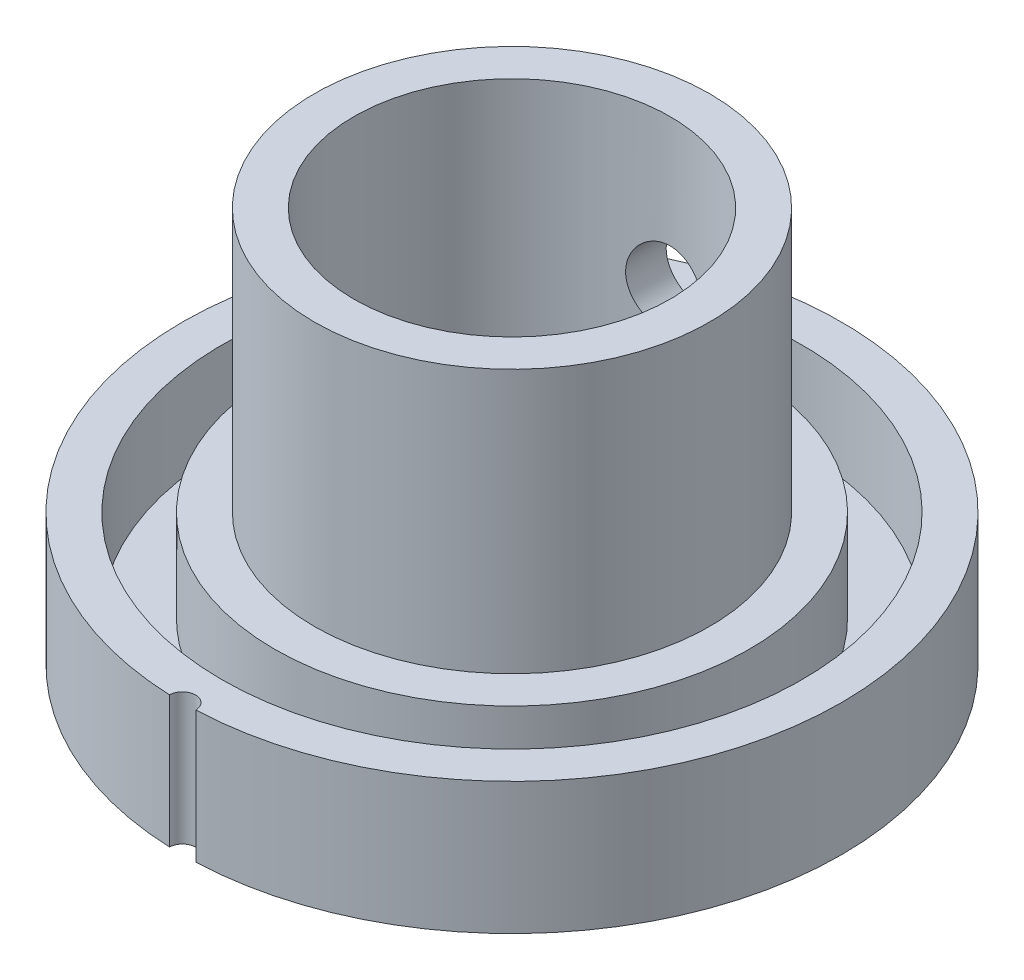
ISO-10303-21;
HEADER;
FILE_DESCRIPTION(('STEP AP214'),'2;1');
FILE_NAME('part.step','',(''),(''),'','','');
FILE_SCHEMA(('AUTOMOTIVE_DESIGN { 1 0 10303 214 1 1 1 1 }'));
ENDSEC;
DATA;
#1=APPLICATION_CONTEXT('core data for automotive mechanical design processes');
#2=APPLICATION_PROTOCOL_DEFINITION('international standard','automotive_design',2000,#1);
#3=PRODUCT_CONTEXT('',#1,'mechanical');
#4=PRODUCT('Part','Part','',(#3));
#5=PRODUCT_RELATED_PRODUCT_CATEGORY('part','',(#4));
#6=PRODUCT_DEFINITION_FORMATION('','',#4);
#7=PRODUCT_DEFINITION_CONTEXT('part definition',#1,'design');
#8=PRODUCT_DEFINITION('design','',#6,#7);
#9=PRODUCT_DEFINITION_SHAPE('','',#8);
#10=(LENGTH_UNIT() NAMED_UNIT(*) SI_UNIT(.MILLI.,.METRE.));
#11=(NAMED_UNIT(*) PLANE_ANGLE_UNIT() SI_UNIT($,.RADIAN.));
#12=(NAMED_UNIT(*) SI_UNIT($,.STERADIAN.) SOLID_ANGLE_UNIT());
#13=UNCERTAINTY_MEASURE_WITH_UNIT(LENGTH_MEASURE(1.E-05),#10,'distance_accuracy_value','');
#14=(GEOMETRIC_REPRESENTATION_CONTEXT(3) GLOBAL_UNCERTAINTY_ASSIGNED_CONTEXT((#13)) GLOBAL_UNIT_ASSIGNED_CONTEXT((#10,
#11,#12)) REPRESENTATION_CONTEXT('',''));
#15=CARTESIAN_POINT('',(0.,0.,0.));
#16=DIRECTION('',(0.,0.,1.));
#17=DIRECTION('',(1.,0.,0.));
#18=AXIS2_PLACEMENT_3D('',#15,#16,#17);
#19=CARTESIAN_POINT('',(0.,0.,0.));
#20=DIRECTION('',(0.,1.,0.));
#21=DIRECTION('',(0.,0.,1.));
#22=AXIS2_PLACEMENT_3D('',#19,#20,#21);
#23=PLANE('',#22);
#24=DIRECTION('',(-1.,0.,0.));
#25=VECTOR('',#24,1.);
#26=CARTESIAN_POINT('',(-7.,0.,-2.));
#27=LINE('',#26,#25);
#28=CARTESIAN_POINT('',(7.,0.,-2.));
#29=VERTEX_POINT('',#28);
#30=CARTESIAN_POINT('',(1.,0.,-2.));
#31=VERTEX_POINT('',#30);
#32=EDGE_CURVE('E164',#29,#31,#27,.T.);
#33=ORIENTED_EDGE('',*,*,#32,.T.);
#34=DIRECTION('',(0.,0.,1.));
#35=VECTOR('',#34,1.);
#36=CARTESIAN_POINT('',(1.,0.,2.));
#37=LINE('',#36,#35);
#38=CARTESIAN_POINT('',(1.,0.,2.));
#39=VERTEX_POINT('',#38);
#40=EDGE_CURVE('E146',#31,#39,#37,.T.);
#41=ORIENTED_EDGE('',*,*,#40,.T.);
#42=DIRECTION('',(1.,0.,0.));
#43=VECTOR('',#42,1.);
#44=CARTESIAN_POINT('',(-7.,0.,2.));
#45=LINE('',#44,#43);
#46=CARTESIAN_POINT('',(7.,0.,2.));
#47=VERTEX_POINT('',#46);
#48=EDGE_CURVE('E152',#39,#47,#45,.T.);
#49=ORIENTED_EDGE('',*,*,#48,.T.);
#50=DIRECTION('',(0.,0.,-1.));
#51=VECTOR('',#50,1.);
#52=CARTESIAN_POINT('',(7.,0.,2.));
#53=LINE('',#52,#51);
#54=EDGE_CURVE('E219',#47,#29,#53,.T.);
#55=ORIENTED_EDGE('',*,*,#54,.T.);
#56=EDGE_LOOP('',(#33,#41,#49,#55));
#57=FACE_BOUND('',#56,.T.);
#58=CARTESIAN_POINT('',(0.,0.,0.));
#59=DIRECTION('',(0.,1.,0.));
#60=DIRECTION('',(0.,0.,1.));
#61=AXIS2_PLACEMENT_3D('',#58,#59,#60);
#62=CIRCLE('',#61,12.5);
#63=CARTESIAN_POINT('',(0.499899989998,0.,12.49));
#64=VERTEX_POINT('',#63);
#65=CARTESIAN_POINT('',(-0.499899989998,0.,12.49));
#66=VERTEX_POINT('',#65);
#67=EDGE_CURVE('E124',#64,#66,#62,.T.);
#68=ORIENTED_EDGE('',*,*,#67,.F.);
#69=CARTESIAN_POINT('',(0.,0.,12.5));
#70=DIRECTION('',(0.,-1.,0.));
#71=DIRECTION('',(0.,0.,-1.));
#72=AXIS2_PLACEMENT_3D('',#69,#70,#71);
#73=CIRCLE('',#72,0.5);
#74=EDGE_CURVE('E113',#66,#64,#73,.T.);
#75=ORIENTED_EDGE('',*,*,#74,.F.);
#76=EDGE_LOOP('',(#68,#75));
#77=FACE_BOUND('',#76,.T.);
#78=DIRECTION('',(0.,0.,-1.));
#79=VECTOR('',#78,1.);
#80=CARTESIAN_POINT('',(-1.,0.,2.));
#81=LINE('',#80,#79);
#82=CARTESIAN_POINT('',(-1.,0.,2.));
#83=VERTEX_POINT('',#82);
#84=CARTESIAN_POINT('',(-1.,0.,-2.));
#85=VERTEX_POINT('',#84);
#86=EDGE_CURVE('E68',#83,#85,#81,.T.);
#87=ORIENTED_EDGE('',*,*,#86,.T.);
#88=CARTESIAN_POINT('',(-7.,0.,-2.));
#89=VERTEX_POINT('',#88);
#90=EDGE_CURVE('E220',#85,#89,#27,.T.);
#91=ORIENTED_EDGE('',*,*,#90,.T.);
#92=DIRECTION('',(0.,0.,1.));
#93=VECTOR('',#92,1.);
#94=CARTESIAN_POINT('',(-7.,0.,2.));
#95=LINE('',#94,#93);
#96=CARTESIAN_POINT('',(-7.,0.,2.));
#97=VERTEX_POINT('',#96);
#98=EDGE_CURVE('E161',#89,#97,#95,.T.);
#99=ORIENTED_EDGE('',*,*,#98,.T.);
#100=EDGE_CURVE('E160',#97,#83,#45,.T.);
#101=ORIENTED_EDGE('',*,*,#100,.T.);
#102=EDGE_LOOP('',(#87,#91,#99,#101));
#103=FACE_BOUND('',#102,.T.);
#104=ADVANCED_FACE('F39',(#57,#77,#103),#23,.F.);
#105=CARTESIAN_POINT('',(0.,5.,0.));
#106=DIRECTION('',(0.,-1.,0.));
#107=DIRECTION('',(0.,0.,-1.));
#108=AXIS2_PLACEMENT_3D('',#105,#106,#107);
#109=CYLINDRICAL_SURFACE('',#108,12.5);
#110=ORIENTED_EDGE('',*,*,#67,.T.);
#111=DIRECTION('',(0.,-1.,0.));
#112=VECTOR('',#111,1.);
#113=CARTESIAN_POINT('',(-0.499899989998,2.5,12.49));
#114=LINE('',#113,#112);
#115=CARTESIAN_POINT('',(-0.499899989997999,5.,12.49));
#116=VERTEX_POINT('',#115);
#117=EDGE_CURVE('E116',#116,#66,#114,.T.);
#118=ORIENTED_EDGE('',*,*,#117,.F.);
#119=CARTESIAN_POINT('',(0.,5.,0.));
#120=DIRECTION('',(0.,1.,0.));
#121=DIRECTION('',(0.,0.,1.));
#122=AXIS2_PLACEMENT_3D('',#119,#120,#121);
#123=CIRCLE('',#122,12.5);
#124=CARTESIAN_POINT('',(0.499899989997999,5.,12.49));
#125=VERTEX_POINT('',#124);
#126=EDGE_CURVE('E126',#125,#116,#123,.T.);
#127=ORIENTED_EDGE('',*,*,#126,.F.);
#128=DIRECTION('',(0.,-1.,0.));
#129=VECTOR('',#128,1.);
#130=CARTESIAN_POINT('',(0.499899989998,2.5,12.49));
#131=LINE('',#130,#129);
#132=EDGE_CURVE('E60',#64,#125,#131,.F.);
#133=ORIENTED_EDGE('',*,*,#132,.F.);
#134=EDGE_LOOP('',(#110,#118,#127,#133));
#135=FACE_BOUND('',#134,.T.);
#136=ADVANCED_FACE('F41',(#135),#109,.T.);
#137=CARTESIAN_POINT('',(0.,5.,0.));
#138=DIRECTION('',(0.,1.,0.));
#139=DIRECTION('',(0.,0.,1.));
#140=AXIS2_PLACEMENT_3D('',#137,#138,#139);
#141=PLANE('',#140);
#142=CARTESIAN_POINT('',(0.,5.,12.5));
#143=DIRECTION('',(0.,1.,0.));
#144=DIRECTION('',(0.,0.,1.));
#145=AXIS2_PLACEMENT_3D('',#142,#143,#144);
#146=CIRCLE('',#145,0.5);
#147=EDGE_CURVE('E120',#116,#125,#146,.F.);
#148=ORIENTED_EDGE('',*,*,#147,.T.);
#149=ORIENTED_EDGE('',*,*,#126,.T.);
#150=EDGE_LOOP('',(#148,#149));
#151=FACE_BOUND('',#150,.T.);
#152=CARTESIAN_POINT('',(0.,5.,0.));
#153=DIRECTION('',(0.,1.,0.));
#154=DIRECTION('',(0.,0.,1.));
#155=AXIS2_PLACEMENT_3D('',#152,#153,#154);
#156=CIRCLE('',#155,11.);
#157=CARTESIAN_POINT('',(0.,5.,11.));
#158=VERTEX_POINT('',#157);
#159=EDGE_CURVE('E192',#158,#158,#156,.T.);
#160=ORIENTED_EDGE('',*,*,#159,.F.);
#161=EDGE_LOOP('',(#160));
#162=FACE_BOUND('',#161,.T.);
#163=ADVANCED_FACE('F187',(#151,#162),#141,.T.);
#164=CARTESIAN_POINT('',(7.,0.,2.));
#165=DIRECTION('',(0.707106781186546,0.707106781186549,0.));
#166=DIRECTION('',(-0.707106781186549,0.707106781186546,0.));
#167=AXIS2_PLACEMENT_3D('',#164,#165,#166);
#168=PLANE('',#167);
#169=ORIENTED_EDGE('',*,*,#54,.F.);
#170=DIRECTION('',(0.577350269189627,-0.577350269189624,0.577350269189627));
#171=VECTOR('',#170,1.);
#172=CARTESIAN_POINT('',(7.,0.,2.));
#173=LINE('',#172,#171);
#174=CARTESIAN_POINT('',(5.,1.99999999999999,0.));
#175=VERTEX_POINT('',#174);
#176=EDGE_CURVE('E156',#175,#47,#173,.T.);
#177=ORIENTED_EDGE('',*,*,#176,.F.);
#178=DIRECTION('',(0.577350269189627,-0.577350269189624,-0.577350269189627));
#179=VECTOR('',#178,1.);
#180=CARTESIAN_POINT('',(2.33333333333332,4.66666666666666,2.66666666666668));
#181=LINE('',#180,#179);
#182=EDGE_CURVE('E168',#175,#29,#181,.T.);
#183=ORIENTED_EDGE('',*,*,#182,.T.);
#184=EDGE_LOOP('',(#169,#177,#183));
#185=FACE_BOUND('',#184,.T.);
#186=ADVANCED_FACE('F239',(#185),#168,.F.);
#187=CARTESIAN_POINT('',(-7.,0.,-2.));
#188=DIRECTION('',(0.,0.707106781186549,-0.707106781186546));
#189=DIRECTION('',(0.,0.707106781186546,0.707106781186549));
#190=AXIS2_PLACEMENT_3D('',#187,#188,#189);
#191=PLANE('',#190);
#192=DIRECTION('',(0.,0.707106781186546,0.707106781186549));
#193=VECTOR('',#192,1.);
#194=CARTESIAN_POINT('',(-1.,0.,-2.));
#195=LINE('',#194,#193);
#196=CARTESIAN_POINT('',(-1.,0.8,-1.2));
#197=VERTEX_POINT('',#196);
#198=EDGE_CURVE('E217',#197,#85,#195,.F.);
#199=ORIENTED_EDGE('',*,*,#198,.F.);
#200=DIRECTION('',(-1.,0.,0.));
#201=VECTOR('',#200,1.);
#202=CARTESIAN_POINT('',(-7.,0.8,-1.2));
#203=LINE('',#202,#201);
#204=CARTESIAN_POINT('',(1.,0.8,-1.2));
#205=VERTEX_POINT('',#204);
#206=EDGE_CURVE('E210',#197,#205,#203,.F.);
#207=ORIENTED_EDGE('',*,*,#206,.T.);
#208=DIRECTION('',(0.,-0.707106781186546,-0.707106781186549));
#209=VECTOR('',#208,1.);
#210=CARTESIAN_POINT('',(1.,0.,-2.));
#211=LINE('',#210,#209);
#212=EDGE_CURVE('E215',#31,#205,#211,.F.);
#213=ORIENTED_EDGE('',*,*,#212,.F.);
#214=ORIENTED_EDGE('',*,*,#32,.F.);
#215=ORIENTED_EDGE('',*,*,#182,.F.);
#216=DIRECTION('',(-1.,0.,0.));
#217=VECTOR('',#216,1.);
#218=CARTESIAN_POINT('',(-7.,1.99999999999999,0.));
#219=LINE('',#218,#217);
#220=CARTESIAN_POINT('',(-5.,1.99999999999999,0.));
#221=VERTEX_POINT('',#220);
#222=EDGE_CURVE('E133',#175,#221,#219,.T.);
#223=ORIENTED_EDGE('',*,*,#222,.T.);
#224=DIRECTION('',(-0.577350269189627,-0.577350269189624,-0.577350269189627));
#225=VECTOR('',#224,1.);
#226=CARTESIAN_POINT('',(-5.66666666666666,1.33333333333333,-0.666666666666663));
#227=LINE('',#226,#225);
#228=EDGE_CURVE('E171',#221,#89,#227,.T.);
#229=ORIENTED_EDGE('',*,*,#228,.T.);
#230=ORIENTED_EDGE('',*,*,#90,.F.);
#231=EDGE_LOOP('',(#199,#207,#213,#214,#215,#223,#229,#230));
#232=FACE_BOUND('',#231,.T.);
#233=ADVANCED_FACE('F227',(#232),#191,.F.);
#234=CARTESIAN_POINT('',(-7.,0.,2.));
#235=DIRECTION('',(-0.707106781186546,0.707106781186549,0.));
#236=DIRECTION('',(-0.707106781186549,-0.707106781186546,0.));
#237=AXIS2_PLACEMENT_3D('',#234,#235,#236);
#238=PLANE('',#237);
#239=ORIENTED_EDGE('',*,*,#98,.F.);
#240=ORIENTED_EDGE('',*,*,#228,.F.);
#241=DIRECTION('',(-0.577350269189627,-0.577350269189624,0.577350269189627));
#242=VECTOR('',#241,1.);
#243=CARTESIAN_POINT('',(-7.,0.,2.));
#244=LINE('',#243,#242);
#245=EDGE_CURVE('E173',#221,#97,#244,.T.);
#246=ORIENTED_EDGE('',*,*,#245,.T.);
#247=EDGE_LOOP('',(#239,#240,#246));
#248=FACE_BOUND('',#247,.T.);
#249=ADVANCED_FACE('F231',(#248),#238,.F.);
#250=CARTESIAN_POINT('',(-7.,0.,2.));
#251=DIRECTION('',(0.,0.707106781186549,0.707106781186546));
#252=DIRECTION('',(0.,-0.707106781186546,0.707106781186549));
#253=AXIS2_PLACEMENT_3D('',#250,#251,#252);
#254=PLANE('',#253);
#255=DIRECTION('',(0.,-0.707106781186546,0.707106781186549));
#256=VECTOR('',#255,1.);
#257=CARTESIAN_POINT('',(-1.,0.,2.));
#258=LINE('',#257,#256);
#259=CARTESIAN_POINT('',(-1.,0.8,1.2));
#260=VERTEX_POINT('',#259);
#261=EDGE_CURVE('E12',#83,#260,#258,.F.);
#262=ORIENTED_EDGE('',*,*,#261,.F.);
#263=ORIENTED_EDGE('',*,*,#100,.F.);
#264=ORIENTED_EDGE('',*,*,#245,.F.);
#265=ORIENTED_EDGE('',*,*,#222,.F.);
#266=ORIENTED_EDGE('',*,*,#176,.T.);
#267=ORIENTED_EDGE('',*,*,#48,.F.);
#268=DIRECTION('',(0.,0.707106781186546,-0.707106781186549));
#269=VECTOR('',#268,1.);
#270=CARTESIAN_POINT('',(1.,0.,2.));
#271=LINE('',#270,#269);
#272=CARTESIAN_POINT('',(1.,0.8,1.2));
#273=VERTEX_POINT('',#272);
#274=EDGE_CURVE('E53',#273,#39,#271,.F.);
#275=ORIENTED_EDGE('',*,*,#274,.F.);
#276=DIRECTION('',(1.,0.,0.));
#277=VECTOR('',#276,1.);
#278=CARTESIAN_POINT('',(-7.,0.8,1.2));
#279=LINE('',#278,#277);
#280=EDGE_CURVE('E137',#273,#260,#279,.F.);
#281=ORIENTED_EDGE('',*,*,#280,.T.);
#282=EDGE_LOOP('',(#262,#263,#264,#265,#266,#267,#275,#281));
#283=FACE_BOUND('',#282,.T.);
#284=ADVANCED_FACE('F154',(#283),#254,.F.);
#285=CARTESIAN_POINT('',(-1.,0.8,2.));
#286=DIRECTION('',(-1.,0.,0.));
#287=DIRECTION('',(0.,0.,1.));
#288=AXIS2_PLACEMENT_3D('',#285,#286,#287);
#289=PLANE('',#288);
#290=DIRECTION('',(0.,0.,-1.));
#291=VECTOR('',#290,1.);
#292=CARTESIAN_POINT('',(-1.,0.8,2.));
#293=LINE('',#292,#291);
#294=EDGE_CURVE('E206',#260,#197,#293,.T.);
#295=ORIENTED_EDGE('',*,*,#294,.T.);
#296=ORIENTED_EDGE('',*,*,#198,.T.);
#297=ORIENTED_EDGE('',*,*,#86,.F.);
#298=ORIENTED_EDGE('',*,*,#261,.T.);
#299=EDGE_LOOP('',(#295,#296,#297,#298));
#300=FACE_BOUND('',#299,.T.);
#301=ADVANCED_FACE('F235',(#300),#289,.T.);
#302=CARTESIAN_POINT('',(1.,0.8,2.));
#303=DIRECTION('',(1.,0.,0.));
#304=DIRECTION('',(0.,0.,-1.));
#305=AXIS2_PLACEMENT_3D('',#302,#303,#304);
#306=PLANE('',#305);
#307=ORIENTED_EDGE('',*,*,#40,.F.);
#308=ORIENTED_EDGE('',*,*,#212,.T.);
#309=DIRECTION('',(0.,0.,1.));
#310=VECTOR('',#309,1.);
#311=CARTESIAN_POINT('',(1.,0.8,2.));
#312=LINE('',#311,#310);
#313=EDGE_CURVE('E149',#205,#273,#312,.T.);
#314=ORIENTED_EDGE('',*,*,#313,.T.);
#315=ORIENTED_EDGE('',*,*,#274,.T.);
#316=EDGE_LOOP('',(#307,#308,#314,#315));
#317=FACE_BOUND('',#316,.T.);
#318=ADVANCED_FACE('F145',(#317),#306,.T.);
#319=CARTESIAN_POINT('',(0.,0.8,0.));
#320=DIRECTION('',(0.,-1.,0.));
#321=DIRECTION('',(0.,0.,-1.));
#322=AXIS2_PLACEMENT_3D('',#319,#320,#321);
#323=PLANE('',#322);
#324=ORIENTED_EDGE('',*,*,#206,.F.);
#325=ORIENTED_EDGE('',*,*,#294,.F.);
#326=ORIENTED_EDGE('',*,*,#280,.F.);
#327=ORIENTED_EDGE('',*,*,#313,.F.);
#328=EDGE_LOOP('',(#324,#325,#326,#327));
#329=FACE_BOUND('',#328,.T.);
#330=ADVANCED_FACE('F237',(#329),#323,.F.);
#331=CARTESIAN_POINT('',(0.,-31.1126983722081,0.));
#332=DIRECTION('',(0.,1.,0.));
#333=DIRECTION('',(0.,0.,1.));
#334=AXIS2_PLACEMENT_3D('',#331,#332,#333);
#335=CYLINDRICAL_SURFACE('',#334,11.);
#336=CARTESIAN_POINT('',(0.,1.5,0.));
#337=DIRECTION('',(0.,1.,0.));
#338=DIRECTION('',(0.,0.,1.));
#339=AXIS2_PLACEMENT_3D('',#336,#337,#338);
#340=CIRCLE('',#339,11.);
#341=CARTESIAN_POINT('',(0.,1.5,11.));
#342=VERTEX_POINT('',#341);
#343=EDGE_CURVE('E196',#342,#342,#340,.F.);
#344=ORIENTED_EDGE('',*,*,#343,.T.);
#345=EDGE_LOOP('',(#344));
#346=FACE_BOUND('',#345,.T.);
#347=ORIENTED_EDGE('',*,*,#159,.T.);
#348=EDGE_LOOP('',(#347));
#349=FACE_BOUND('',#348,.T.);
#350=ADVANCED_FACE('F282',(#346,#349),#335,.F.);
#351=CARTESIAN_POINT('',(0.,-31.1126983722081,0.));
#352=DIRECTION('',(0.,1.,0.));
#353=DIRECTION('',(0.,0.,1.));
#354=AXIS2_PLACEMENT_3D('',#351,#352,#353);
#355=CYLINDRICAL_SURFACE('',#354,9.);
#356=CARTESIAN_POINT('',(0.,1.5,0.));
#357=DIRECTION('',(0.,1.,0.));
#358=DIRECTION('',(0.,0.,1.));
#359=AXIS2_PLACEMENT_3D('',#356,#357,#358);
#360=CIRCLE('',#359,9.);
#361=CARTESIAN_POINT('',(0.,1.5,9.));
#362=VERTEX_POINT('',#361);
#363=EDGE_CURVE('E203',#362,#362,#360,.F.);
#364=ORIENTED_EDGE('',*,*,#363,.F.);
#365=EDGE_LOOP('',(#364));
#366=FACE_BOUND('',#365,.T.);
#367=CARTESIAN_POINT('',(0.,5.,0.));
#368=DIRECTION('',(0.,1.,0.));
#369=DIRECTION('',(0.,0.,1.));
#370=AXIS2_PLACEMENT_3D('',#367,#368,#369);
#371=CIRCLE('',#370,9.);
#372=CARTESIAN_POINT('',(0.,5.,9.));
#373=VERTEX_POINT('',#372);
#374=EDGE_CURVE('E190',#373,#373,#371,.T.);
#375=ORIENTED_EDGE('',*,*,#374,.F.);
#376=EDGE_LOOP('',(#375));
#377=FACE_BOUND('',#376,.T.);
#378=ADVANCED_FACE('F278',(#366,#377),#355,.T.);
#379=CARTESIAN_POINT('',(0.,1.5,0.));
#380=DIRECTION('',(0.,1.,0.));
#381=DIRECTION('',(0.,0.,1.));
#382=AXIS2_PLACEMENT_3D('',#379,#380,#381);
#383=PLANE('',#382);
#384=ORIENTED_EDGE('',*,*,#343,.F.);
#385=EDGE_LOOP('',(#384));
#386=FACE_BOUND('',#385,.T.);
#387=ORIENTED_EDGE('',*,*,#363,.T.);
#388=EDGE_LOOP('',(#387));
#389=FACE_BOUND('',#388,.T.);
#390=ADVANCED_FACE('F275',(#386,#389),#383,.T.);
#391=CARTESIAN_POINT('',(0.,15.,0.));
#392=DIRECTION('',(0.,1.,0.));
#393=DIRECTION('',(0.,0.,1.));
#394=AXIS2_PLACEMENT_3D('',#391,#392,#393);
#395=PLANE('',#394);
#396=CARTESIAN_POINT('',(0.,15.,0.));
#397=DIRECTION('',(0.,1.,0.));
#398=DIRECTION('',(0.,0.,1.));
#399=AXIS2_PLACEMENT_3D('',#396,#397,#398);
#400=CIRCLE('',#399,6.);
#401=CARTESIAN_POINT('',(0.,15.,6.));
#402=VERTEX_POINT('',#401);
#403=EDGE_CURVE('E199',#402,#402,#400,.T.);
#404=ORIENTED_EDGE('',*,*,#403,.F.);
#405=EDGE_LOOP('',(#404));
#406=FACE_BOUND('',#405,.T.);
#407=CARTESIAN_POINT('',(0.,15.,0.));
#408=DIRECTION('',(0.,1.,0.));
#409=DIRECTION('',(0.,0.,1.));
#410=AXIS2_PLACEMENT_3D('',#407,#408,#409);
#411=CIRCLE('',#410,7.5);
#412=CARTESIAN_POINT('',(0.,15.,7.5));
#413=VERTEX_POINT('',#412);
#414=EDGE_CURVE('E128',#413,#413,#411,.T.);
#415=ORIENTED_EDGE('',*,*,#414,.T.);
#416=EDGE_LOOP('',(#415));
#417=FACE_BOUND('',#416,.T.);
#418=ADVANCED_FACE('F250',(#406,#417),#395,.T.);
#419=CARTESIAN_POINT('',(0.,15.,0.));
#420=DIRECTION('',(0.,-1.,0.));
#421=DIRECTION('',(0.,0.,-1.));
#422=AXIS2_PLACEMENT_3D('',#419,#420,#421);
#423=CYLINDRICAL_SURFACE('',#422,7.5);
#424=CARTESIAN_POINT('',(0.,10.75,-7.5));
#425=CARTESIAN_POINT('',(-0.0833653601889497,10.7499969332525,-7.49999846371307));
#426=CARTESIAN_POINT('',(-0.166769490302283,10.7430267355485,-7.49859577767346));
#427=CARTESIAN_POINT('',(-0.331220261533529,10.7153522498271,-7.49313548434847));
#428=CARTESIAN_POINT('',(-0.412264976312033,10.6946370507977,-7.48907576790279));
#429=CARTESIAN_POINT('',(-0.569595457894969,10.6401380895688,-7.4787547391743));
#430=CARTESIAN_POINT('',(-0.645885701899701,10.606366844733,-7.47249553615077));
#431=CARTESIAN_POINT('',(-0.791711983296338,10.5267516287331,-7.45845597052971));
#432=CARTESIAN_POINT('',(-0.861248422613717,10.4809083765892,-7.4506756985356));
#433=CARTESIAN_POINT('',(-0.992540215972297,10.3777922585629,-7.43433247994955));
#434=CARTESIAN_POINT('',(-1.05419092673779,10.3203874669132,-7.42576118256521));
#435=CARTESIAN_POINT('',(-1.16705513491204,10.1960613754124,-7.40886270678882));
#436=CARTESIAN_POINT('',(-1.21826781715564,10.1291393329973,-7.40053554750636));
#437=CARTESIAN_POINT('',(-1.30924763002143,9.98692571048219,-7.38498662718923));
#438=CARTESIAN_POINT('',(-1.3489064082988,9.91156353430546,-7.37777561047419));
#439=CARTESIAN_POINT('',(-1.41495849987046,9.75507727149388,-7.36539402087627));
#440=CARTESIAN_POINT('',(-1.44135312365586,9.67395375498048,-7.36022324642942));
#441=CARTESIAN_POINT('',(-1.47978794982724,9.50937345413812,-7.35259207878307));
#442=CARTESIAN_POINT('',(-1.49201174693817,9.42596118378666,-7.35009705160781));
#443=CARTESIAN_POINT('',(-1.50232819158918,9.25823526795349,-7.34799562590941));
#444=CARTESIAN_POINT('',(-1.50042228407025,9.17392171551978,-7.34838893201761));
#445=CARTESIAN_POINT('',(-1.48268185965273,9.0081298179685,-7.35198826722277));
#446=CARTESIAN_POINT('',(-1.46705781036586,8.92662789155903,-7.35515179288145));
#447=CARTESIAN_POINT('',(-1.42265682693458,8.7674258850055,-7.36386819240002));
#448=CARTESIAN_POINT('',(-1.39387926465102,8.68972598662149,-7.36942118036668));
#449=CARTESIAN_POINT('',(-1.32378717551208,8.5397271074446,-7.38233427750612));
#450=CARTESIAN_POINT('',(-1.28238922684817,8.46746818064624,-7.38970634720557));
#451=CARTESIAN_POINT('',(-1.18829036185902,8.33084372504078,-7.40541928159593));
#452=CARTESIAN_POINT('',(-1.13558814653524,8.26647910472327,-7.41376025757549));
#453=CARTESIAN_POINT('',(-1.01924990184088,8.1462558963146,-7.43065531862193));
#454=CARTESIAN_POINT('',(-0.955434241818668,8.09057114821131,-7.43921053816357));
#455=CARTESIAN_POINT('',(-0.819277536093015,7.99066923054817,-7.45543273071613));
#456=CARTESIAN_POINT('',(-0.746936381069084,7.94645220805963,-7.4630996923346));
#457=CARTESIAN_POINT('',(-0.595589080318382,7.87070873616104,-7.47670035241331));
#458=CARTESIAN_POINT('',(-0.516572729377951,7.8392021595332,-7.48263133272408));
#459=CARTESIAN_POINT('',(-0.354223464672998,7.78995928894215,-7.49207113481787));
#460=CARTESIAN_POINT('',(-0.270891075108675,7.77222132688956,-7.49558025000797));
#461=CARTESIAN_POINT('',(-0.103769108440727,7.75126531930858,-7.49974007800301));
#462=CARTESIAN_POINT('',(-0.0200104924883651,7.7478093706896,-7.50043761978705));
#463=CARTESIAN_POINT('',(0.14688740128907,7.75487478841327,-7.49902577895154));
#464=CARTESIAN_POINT('',(0.230026713665689,7.76539536902889,-7.49691655412169));
#465=CARTESIAN_POINT('',(0.392558489919811,7.79991756031594,-7.49015748012026));
#466=CARTESIAN_POINT('',(0.471977922509854,7.82379710274686,-7.4855306460631));
#467=CARTESIAN_POINT('',(0.6256854412495,7.88422597398372,-7.47425328091549));
#468=CARTESIAN_POINT('',(0.699973142456309,7.92077625201525,-7.4676025982134));
#469=CARTESIAN_POINT('',(0.842311760529326,8.00602373597697,-7.45289867299942));
#470=CARTESIAN_POINT('',(0.910275190128281,8.05486417155842,-7.44482925655578));
#471=CARTESIAN_POINT('',(1.03712702867881,8.16311378681092,-7.42822102244824));
#472=CARTESIAN_POINT('',(1.09601446339614,8.2225240995998,-7.41968215452582));
#473=CARTESIAN_POINT('',(1.20396088616126,8.35131002783669,-7.40293955335447));
#474=CARTESIAN_POINT('',(1.25285655367298,8.42082361633201,-7.39474290349956));
#475=CARTESIAN_POINT('',(1.33827813007681,8.56721704203502,-7.37976287694291));
#476=CARTESIAN_POINT('',(1.37480453388435,8.64409658436033,-7.37297944370014));
#477=CARTESIAN_POINT('',(1.43422776237294,8.80265236922432,-7.36165110876574));
#478=CARTESIAN_POINT('',(1.45719524968658,8.88430126181548,-7.3570946230828));
#479=CARTESIAN_POINT('',(1.48906297744079,9.05040018023636,-7.35071155188038));
#480=CARTESIAN_POINT('',(1.49796505233767,9.13484983931402,-7.34888461036667));
#481=CARTESIAN_POINT('',(1.5013813663012,9.30251329681648,-7.34818724447069));
#482=CARTESIAN_POINT('',(1.49615368210634,9.38572172339052,-7.34926378783951));
#483=CARTESIAN_POINT('',(1.47202845615009,9.55004747485754,-7.35413360226921));
#484=CARTESIAN_POINT('',(1.45313102419395,9.63116481654221,-7.35792685150754));
#485=CARTESIAN_POINT('',(1.40231785274843,9.78884156686082,-7.36777896328738));
#486=CARTESIAN_POINT('',(1.37043376007602,9.86541154075362,-7.37383231528246));
#487=CARTESIAN_POINT('',(1.29458196690241,10.0121555811017,-7.38752572461255));
#488=CARTESIAN_POINT('',(1.25061325316232,10.0823291105877,-7.39516591498341));
#489=CARTESIAN_POINT('',(1.15095887217962,10.2155733582255,-7.41133440784838));
#490=CARTESIAN_POINT('',(1.09508683085277,10.2785031479014,-7.41987559364549));
#491=CARTESIAN_POINT('',(0.973596553519712,10.3941793082938,-7.43679122807932));
#492=CARTESIAN_POINT('',(0.907976080730004,10.4469233354759,-7.44516563794777));
#493=CARTESIAN_POINT('',(0.76802644363237,10.5412519659197,-7.46090748581957));
#494=CARTESIAN_POINT('',(0.693613326644752,10.58271400492,-7.46826346828869));
#495=CARTESIAN_POINT('',(0.538749541411099,10.6524791838949,-7.481026876275));
#496=CARTESIAN_POINT('',(0.458304391294689,10.6807941842987,-7.48643605707924));
#497=CARTESIAN_POINT('',(0.314732233385669,10.7179779220671,-7.49364558893056));
#498=CARTESIAN_POINT('',(0.252422496020677,10.7299647905616,-7.49601454737677));
#499=CARTESIAN_POINT('',(0.1267492878151,10.7459768685375,-7.49919231209839));
#500=CARTESIAN_POINT('',(0.0633858506229285,10.7500023317647,-7.50000116809732));
#501=CARTESIAN_POINT('',(0.,10.75,-7.5));
#502=B_SPLINE_CURVE_WITH_KNOTS('',3,(#424,#425,#426,#427,#428,#429,#430,#431,#432,#433,#434,
#435,#436,#437,#438,#439,#440,#441,#442,#443,#444,#445,#446,#447,#448,#449,#450,#451,#452,#453,
#454,#455,#456,#457,#458,#459,#460,#461,#462,#463,#464,#465,#466,#467,#468,#469,#470,#471,#472,
#473,#474,#475,#476,#477,#478,#479,#480,#481,#482,#483,#484,#485,#486,#487,#488,#489,#490,#491,
#492,#493,#494,#495,#496,#497,#498,#499,#500,#501),.UNSPECIFIED.,.T.,.F.,(4,2,2,2,2,2,2,2,2,2,2,
2,2,2,2,2,2,2,2,2,2,2,2,2,2,2,2,2,2,2,2,2,2,2,2,2,2,2,4),(0.,0.249864195991888,
0.499926976036984,0.749750602875512,0.999559353346295,1.25239900516828,1.50525839512105,
1.76041792508884,2.01555224047796,2.26734277655381,2.51910756421838,2.76707590509417,
3.01505608880594,3.26471235305389,3.51439732124505,3.76857378737026,4.0227535130973,
4.27732912281035,4.53187388547054,4.78216103514397,5.03243411486801,5.28045680926085,
5.52849808824033,5.77957599050038,6.03068082518895,6.28560942868838,6.54052783085199,
6.79410571549084,7.04765052495622,7.29659583851552,7.54553915238912,7.79387941879664,
8.04224051372799,8.29482114358714,8.54745981799395,8.80274245013455,9.05779433276277,
9.2477816293484,9.43776287056494),.UNSPECIFIED.);
#503=CARTESIAN_POINT('',(0.,10.75,-7.5));
#504=VERTEX_POINT('',#503);
#505=EDGE_CURVE('E254',#504,#504,#502,.T.);
#506=ORIENTED_EDGE('',*,*,#505,.T.);
#507=EDGE_LOOP('',(#506));
#508=FACE_BOUND('',#507,.T.);
#509=ORIENTED_EDGE('',*,*,#414,.F.);
#510=EDGE_LOOP('',(#509));
#511=FACE_BOUND('',#510,.T.);
#512=CARTESIAN_POINT('',(0.,5.,0.));
#513=DIRECTION('',(0.,1.,0.));
#514=DIRECTION('',(0.,0.,1.));
#515=AXIS2_PLACEMENT_3D('',#512,#513,#514);
#516=CIRCLE('',#515,7.5);
#517=CARTESIAN_POINT('',(0.,5.,7.5));
#518=VERTEX_POINT('',#517);
#519=EDGE_CURVE('E130',#518,#518,#516,.T.);
#520=ORIENTED_EDGE('',*,*,#519,.T.);
#521=EDGE_LOOP('',(#520));
#522=FACE_BOUND('',#521,.T.);
#523=ADVANCED_FACE('F180',(#508,#511,#522),#423,.T.);
#524=ORIENTED_EDGE('',*,*,#519,.F.);
#525=EDGE_LOOP('',(#524));
#526=FACE_BOUND('',#525,.T.);
#527=ORIENTED_EDGE('',*,*,#374,.T.);
#528=EDGE_LOOP('',(#527));
#529=FACE_BOUND('',#528,.T.);
#530=ADVANCED_FACE('F182',(#526,#529),#141,.T.);
#531=CARTESIAN_POINT('',(0.,-16.9705627484771,0.));
#532=DIRECTION('',(0.,1.,0.));
#533=DIRECTION('',(0.,0.,1.));
#534=AXIS2_PLACEMENT_3D('',#531,#532,#533);
#535=CYLINDRICAL_SURFACE('',#534,6.);
#536=CARTESIAN_POINT('',(1.5,9.25,-5.80947501931113));
#537=CARTESIAN_POINT('',(1.49999764715507,9.16716954944524,-5.80947660051185));
#538=CARTESIAN_POINT('',(1.49311574729838,9.0843130607932,-5.81126583608348));
#539=CARTESIAN_POINT('',(1.46581387527848,8.92097945309558,-5.81821117195949));
#540=CARTESIAN_POINT('',(1.44538602404532,8.84050374731901,-5.82336923173088));
#541=CARTESIAN_POINT('',(1.39169471977917,8.68431787708778,-5.8364323475758));
#542=CARTESIAN_POINT('',(1.35844783671268,8.6086017067686,-5.84433385614245));
#543=CARTESIAN_POINT('',(1.28011268475685,8.46381348847605,-5.86198915217285));
#544=CARTESIAN_POINT('',(1.23502391313642,8.39474172275186,-5.87174301827101));
#545=CARTESIAN_POINT('',(1.13322505638712,8.26368301284268,-5.89224429813367));
#546=CARTESIAN_POINT('',(1.07630213262243,8.20186383978997,-5.90300758573818));
#547=CARTESIAN_POINT('',(0.952909238460399,8.0885431633838,-5.92417725309178));
#548=CARTESIAN_POINT('',(0.886438376508185,8.03704262462695,-5.93458359939834));
#549=CARTESIAN_POINT('',(0.744687120647374,7.94513471942124,-5.95404249312349));
#550=CARTESIAN_POINT('',(0.669296745717073,7.90489216710312,-5.96307412440355));
#551=CARTESIAN_POINT('',(0.512557910575658,7.83771421350815,-5.97858487155591));
#552=CARTESIAN_POINT('',(0.431210331475165,7.81077684885069,-5.98506436400607));
#553=CARTESIAN_POINT('',(0.266615255252498,7.77151129925285,-5.99462855308908));
#554=CARTESIAN_POINT('',(0.183439631729386,7.75889821340405,-5.99777936306589));
#555=CARTESIAN_POINT('',(0.0160972915576626,7.74774497243467,-6.00056156464379));
#556=CARTESIAN_POINT('',(-0.06806927672284,7.74920273667424,-6.00019347658022));
#557=CARTESIAN_POINT('',(-0.23302837075858,7.76594491015009,-5.99602856972121));
#558=CARTESIAN_POINT('',(-0.3138543234016,7.78092179503231,-5.99230801404524));
#559=CARTESIAN_POINT('',(-0.471807371120529,7.8237827620291,-5.98194501914912));
#560=CARTESIAN_POINT('',(-0.548934269055656,7.85166753122645,-5.97530242439065));
#561=CARTESIAN_POINT('',(-0.698110055252709,7.91980154241224,-5.95972505820537));
#562=CARTESIAN_POINT('',(-0.770106764649756,7.96016022679705,-5.95077011817032));
#563=CARTESIAN_POINT('',(-0.906413433510732,8.05201340746975,-5.9315394228579));
#564=CARTESIAN_POINT('',(-0.970722052628257,8.10350984113637,-5.92126343791494));
#565=CARTESIAN_POINT('',(-1.09166105262743,8.21782524518943,-5.90018228261712));
#566=CARTESIAN_POINT('',(-1.1480365186128,8.28091293540866,-5.88937031715551));
#567=CARTESIAN_POINT('',(-1.24946456394453,8.41575998412415,-5.86869026110024));
#568=CARTESIAN_POINT('',(-1.29451661406902,8.4875197476946,-5.85882221463582));
#569=CARTESIAN_POINT('',(-1.3721821935339,8.63817402048938,-5.84112298098989));
#570=CARTESIAN_POINT('',(-1.40473435045574,8.71710143818792,-5.83330190235432));
#571=CARTESIAN_POINT('',(-1.45602843095451,8.87955128084587,-5.82071184083974));
#572=CARTESIAN_POINT('',(-1.47477330982936,8.96307271838988,-5.81594220486131));
#573=CARTESIAN_POINT('',(-1.49749778319911,9.12997570091387,-5.81013213623485));
#574=CARTESIAN_POINT('',(-1.50185428435178,9.21330267599778,-5.80899653456189));
#575=CARTESIAN_POINT('',(-1.49671019430933,9.3794931619469,-5.81032406088624));
#576=CARTESIAN_POINT('',(-1.48721087870928,9.46235671477075,-5.8127868576076));
#577=CARTESIAN_POINT('',(-1.4549552783626,9.62386855897283,-5.82094249172736));
#578=CARTESIAN_POINT('',(-1.43241844096905,9.70256363594251,-5.82658182140625));
#579=CARTESIAN_POINT('',(-1.37497084900237,9.85505887471101,-5.84040430962578));
#580=CARTESIAN_POINT('',(-1.34005862862753,9.9288584554332,-5.84858776949168));
#581=CARTESIAN_POINT('',(-1.25806240076193,10.0710647667204,-5.86677682255958));
#582=CARTESIAN_POINT('',(-1.21075305230138,10.1393373040259,-5.87681501163985));
#583=CARTESIAN_POINT('',(-1.10559043940169,10.2671130176808,-5.8975024984303));
#584=CARTESIAN_POINT('',(-1.04773544220816,10.32661474999,-5.90815189637082));
#585=CARTESIAN_POINT('',(-0.921394081477089,10.4366866255426,-5.92918441818964));
#586=CARTESIAN_POINT('',(-0.85267792879739,10.4869960375293,-5.93955421237102));
#587=CARTESIAN_POINT('',(-0.707554024042014,10.5753615201707,-5.95858329968241));
#588=CARTESIAN_POINT('',(-0.631146673436387,10.6134182299649,-5.96724268202376));
#589=CARTESIAN_POINT('',(-0.473337302596635,10.6758676207168,-5.98182069442989));
#590=CARTESIAN_POINT('',(-0.391976071541822,10.7003585706274,-5.98775898013446));
#591=CARTESIAN_POINT('',(-0.226124640478212,10.735276200765,-5.99631176037473));
#592=CARTESIAN_POINT('',(-0.141635047561866,10.7457055952434,-5.99892689636045));
#593=CARTESIAN_POINT('',(0.0256252896649883,10.7520513843633,-6.00051254113217));
#594=CARTESIAN_POINT('',(0.108380740449048,10.7483525636431,-5.99957968320012));
#595=CARTESIAN_POINT('',(0.272051244622108,10.7274282590585,-5.99438844686135));
#596=CARTESIAN_POINT('',(0.352966352671329,10.7102031774803,-5.99013016735643));
#597=CARTESIAN_POINT('',(0.510256553467223,10.6629216703436,-5.97878149280944));
#598=CARTESIAN_POINT('',(0.586653741871527,10.6329348200281,-5.97170646753999));
#599=CARTESIAN_POINT('',(0.733375579562201,10.561044131471,-5.95546933370076));
#600=CARTESIAN_POINT('',(0.803699461897576,10.5191387909957,-5.94630696206604));
#601=CARTESIAN_POINT('',(0.938102892635848,10.4234271490044,-5.92660874521999));
#602=CARTESIAN_POINT('',(1.00199248245088,10.3693597856389,-5.91604525418417));
#603=CARTESIAN_POINT('',(1.11992253040688,10.2513657220393,-5.89485973579863));
#604=CARTESIAN_POINT('',(1.17396048760228,10.1874365258531,-5.88423769428834));
#605=CARTESIAN_POINT('',(1.27164303971884,10.050097878698,-5.86391213790822));
#606=CARTESIAN_POINT('',(1.31507492916982,9.97653381488106,-5.85422945594827));
#607=CARTESIAN_POINT('',(1.3888903449235,9.82291676511595,-5.83715933325924));
#608=CARTESIAN_POINT('',(1.41928336463958,9.74286855083989,-5.82977022370054));
#609=CARTESIAN_POINT('',(1.46163379284816,9.59413448225993,-5.81927863109675));
#610=CARTESIAN_POINT('',(1.47598975589307,9.52616025342421,-5.8156299450082));
#611=CARTESIAN_POINT('',(1.4951734388599,9.38879669650006,-5.81072757878358));
#612=CARTESIAN_POINT('',(1.50000197155828,9.31940748963241,-5.80947369434945));
#613=CARTESIAN_POINT('',(1.5,9.25,-5.80947501931113));
#614=B_SPLINE_CURVE_WITH_KNOTS('',3,(#536,#537,#538,#539,#540,#541,#542,#543,#544,#545,#546,
#547,#548,#549,#550,#551,#552,#553,#554,#555,#556,#557,#558,#559,#560,#561,#562,#563,#564,#565,
#566,#567,#568,#569,#570,#571,#572,#573,#574,#575,#576,#577,#578,#579,#580,#581,#582,#583,#584,
#585,#586,#587,#588,#589,#590,#591,#592,#593,#594,#595,#596,#597,#598,#599,#600,#601,#602,#603,
#604,#605,#606,#607,#608,#609,#610,#611,#612,#613),.UNSPECIFIED.,.T.,.F.,(4,2,2,2,2,2,2,2,2,2,2,
2,2,2,2,2,2,2,2,2,2,2,2,2,2,2,2,2,2,2,2,2,2,2,2,2,2,2,4),(0.,0.24823646504168,0.496617444857199,
0.744678436299613,0.992749960532872,1.24574372515786,1.4987611288792,1.75530897838752,
2.01181895908255,2.26313250597208,2.51440889199612,2.76010957613368,3.00582334034872,
3.25375724552667,3.50173431281348,3.75642279943147,4.01112318719881,4.26705859205041,
4.52293920077728,4.77206144857031,5.02116076310281,5.26618443005524,5.51123712852851,
5.76109707515494,6.01099811331027,6.26715198579191,6.52329249431732,6.77755243684158,
7.03176329345423,7.27910067676474,7.52643070426188,7.77242925935826,8.01845883442843,
8.27038257949242,8.52237018939305,8.77905886370806,9.03556032819972,9.24358696306398,
9.45159585059712),.UNSPECIFIED.);
#615=CARTESIAN_POINT('',(1.5,9.25,-5.80947501931113));
#616=VERTEX_POINT('',#615);
#617=EDGE_CURVE('E43',#616,#616,#614,.T.);
#618=ORIENTED_EDGE('',*,*,#617,.T.);
#619=EDGE_LOOP('',(#618));
#620=FACE_BOUND('',#619,.T.);
#621=CARTESIAN_POINT('',(0.,3.5,0.));
#622=DIRECTION('',(0.,1.,0.));
#623=DIRECTION('',(0.,0.,1.));
#624=AXIS2_PLACEMENT_3D('',#621,#622,#623);
#625=CIRCLE('',#624,6.);
#626=CARTESIAN_POINT('',(0.,3.5,6.));
#627=VERTEX_POINT('',#626);
#628=EDGE_CURVE('E193',#627,#627,#625,.F.);
#629=ORIENTED_EDGE('',*,*,#628,.T.);
#630=EDGE_LOOP('',(#629));
#631=FACE_BOUND('',#630,.T.);
#632=ORIENTED_EDGE('',*,*,#403,.T.);
#633=EDGE_LOOP('',(#632));
#634=FACE_BOUND('',#633,.T.);
#635=ADVANCED_FACE('F185',(#620,#631,#634),#535,.F.);
#636=CARTESIAN_POINT('',(0.,3.5,0.));
#637=DIRECTION('',(0.,1.,0.));
#638=DIRECTION('',(0.,0.,1.));
#639=AXIS2_PLACEMENT_3D('',#636,#637,#638);
#640=PLANE('',#639);
#641=ORIENTED_EDGE('',*,*,#628,.F.);
#642=EDGE_LOOP('',(#641));
#643=FACE_BOUND('',#642,.T.);
#644=ADVANCED_FACE('F266',(#643),#640,.T.);
#645=CARTESIAN_POINT('',(0.,9.25,-12.5));
#646=DIRECTION('',(0.,0.,1.));
#647=DIRECTION('',(1.,0.,0.));
#648=AXIS2_PLACEMENT_3D('',#645,#646,#647);
#649=CYLINDRICAL_SURFACE('',#648,1.5);
#650=ORIENTED_EDGE('',*,*,#617,.F.);
#651=EDGE_LOOP('',(#650));
#652=FACE_BOUND('',#651,.T.);
#653=ORIENTED_EDGE('',*,*,#505,.F.);
#654=EDGE_LOOP('',(#653));
#655=FACE_BOUND('',#654,.T.);
#656=ADVANCED_FACE('F261',(#652,#655),#649,.F.);
#657=CARTESIAN_POINT('',(0.,15.001,12.5));
#658=DIRECTION('',(0.,-1.,0.));
#659=DIRECTION('',(0.,0.,-1.));
#660=AXIS2_PLACEMENT_3D('',#657,#658,#659);
#661=CYLINDRICAL_SURFACE('',#660,0.5);
#662=ORIENTED_EDGE('',*,*,#132,.T.);
#663=ORIENTED_EDGE('',*,*,#147,.F.);
#664=ORIENTED_EDGE('',*,*,#117,.T.);
#665=ORIENTED_EDGE('',*,*,#74,.T.);
#666=EDGE_LOOP('',(#662,#663,#664,#665));
#667=FACE_BOUND('',#666,.T.);
#668=ADVANCED_FACE('F114',(#667),#661,.F.);
#669=CLOSED_SHELL('',(#104,#136,#163,#186,#233,#249,#284,#301,#318,#330,#350,#378,#390,#418,
#523,#530,#635,#644,#656,#668));
#670=MANIFOLD_SOLID_BREP('B2',#669);
#671=ADVANCED_BREP_SHAPE_REPRESENTATION('',(#18,#670),#14);
#672=SHAPE_DEFINITION_REPRESENTATION(#9,#671);
ENDSEC;
END-ISO-10303-21;
